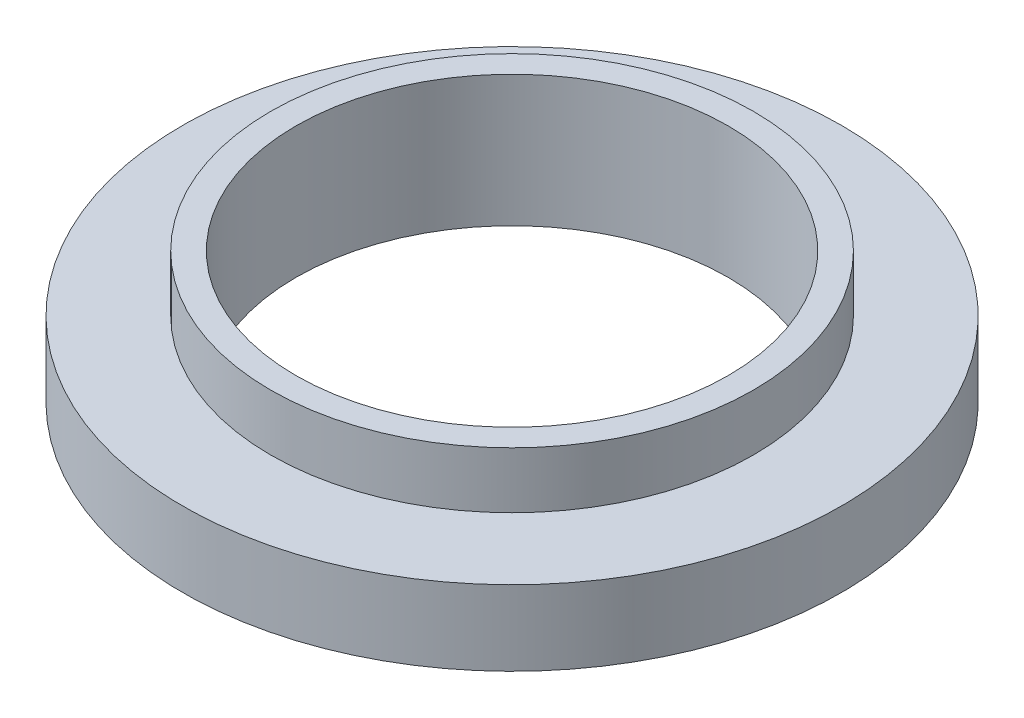
ISO-10303-21;
HEADER;
FILE_DESCRIPTION(('STEP AP214'),'2;1');
FILE_NAME('part.step','',(''),(''),'','','');
FILE_SCHEMA(('AUTOMOTIVE_DESIGN { 1 0 10303 214 1 1 1 1 }'));
ENDSEC;
DATA;
#1=APPLICATION_CONTEXT('core data for automotive mechanical design processes');
#2=APPLICATION_PROTOCOL_DEFINITION('international standard','automotive_design',2000,#1);
#3=PRODUCT_CONTEXT('',#1,'mechanical');
#4=PRODUCT('Part','Part','',(#3));
#5=PRODUCT_RELATED_PRODUCT_CATEGORY('part','',(#4));
#6=PRODUCT_DEFINITION_FORMATION('','',#4);
#7=PRODUCT_DEFINITION_CONTEXT('part definition',#1,'design');
#8=PRODUCT_DEFINITION('design','',#6,#7);
#9=PRODUCT_DEFINITION_SHAPE('','',#8);
#10=(LENGTH_UNIT() NAMED_UNIT(*) SI_UNIT(.MILLI.,.METRE.));
#11=(NAMED_UNIT(*) PLANE_ANGLE_UNIT() SI_UNIT($,.RADIAN.));
#12=(NAMED_UNIT(*) SI_UNIT($,.STERADIAN.) SOLID_ANGLE_UNIT());
#13=UNCERTAINTY_MEASURE_WITH_UNIT(LENGTH_MEASURE(1.E-05),#10,'distance_accuracy_value','');
#14=(GEOMETRIC_REPRESENTATION_CONTEXT(3) GLOBAL_UNCERTAINTY_ASSIGNED_CONTEXT((#13)) GLOBAL_UNIT_ASSIGNED_CONTEXT((#10,
#11,#12)) REPRESENTATION_CONTEXT('',''));
#15=CARTESIAN_POINT('',(0.,0.,0.));
#16=DIRECTION('',(0.,0.,1.));
#17=DIRECTION('',(1.,0.,0.));
#18=AXIS2_PLACEMENT_3D('',#15,#16,#17);
#19=CARTESIAN_POINT('',(0.,0.,0.));
#20=DIRECTION('',(0.,-1.,0.));
#21=DIRECTION('',(0.,0.,-1.));
#22=AXIS2_PLACEMENT_3D('',#19,#20,#21);
#23=CYLINDRICAL_SURFACE('',#22,35.45);
#24=CARTESIAN_POINT('',(0.,22.0238096535735,0.));
#25=DIRECTION('',(0.,-1.,0.));
#26=DIRECTION('',(0.,0.,-1.));
#27=AXIS2_PLACEMENT_3D('',#24,#25,#26);
#28=CIRCLE('',#27,35.45);
#29=CARTESIAN_POINT('',(0.,22.0238096535735,-35.45));
#30=VERTEX_POINT('',#29);
#31=EDGE_CURVE('E54',#30,#30,#28,.T.);
#32=ORIENTED_EDGE('',*,*,#31,.F.);
#33=EDGE_LOOP('',(#32));
#34=FACE_BOUND('',#33,.T.);
#35=CARTESIAN_POINT('',(0.,30.28420647366,0.));
#36=DIRECTION('',(0.,-1.,0.));
#37=DIRECTION('',(0.,0.,-1.));
#38=AXIS2_PLACEMENT_3D('',#35,#36,#37);
#39=CIRCLE('',#38,35.45);
#40=CARTESIAN_POINT('',(0.,30.28420647366,-35.45));
#41=VERTEX_POINT('',#40);
#42=EDGE_CURVE('E10',#41,#41,#39,.T.);
#43=ORIENTED_EDGE('',*,*,#42,.T.);
#44=EDGE_LOOP('',(#43));
#45=FACE_BOUND('',#44,.T.);
#46=ADVANCED_FACE('F32',(#34,#45),#23,.T.);
#47=CARTESIAN_POINT('',(-31.75,30.28420647366,0.));
#48=DIRECTION('',(0.,-1.,0.));
#49=DIRECTION('',(0.,0.,-1.));
#50=AXIS2_PLACEMENT_3D('',#47,#48,#49);
#51=PLANE('',#50);
#52=ORIENTED_EDGE('',*,*,#42,.F.);
#53=EDGE_LOOP('',(#52));
#54=FACE_BOUND('',#53,.T.);
#55=CARTESIAN_POINT('',(0.,30.28420647366,0.));
#56=DIRECTION('',(0.,-1.,0.));
#57=DIRECTION('',(0.,0.,-1.));
#58=AXIS2_PLACEMENT_3D('',#55,#56,#57);
#59=CIRCLE('',#58,31.75);
#60=CARTESIAN_POINT('',(0.,30.28420647366,-31.75));
#61=VERTEX_POINT('',#60);
#62=EDGE_CURVE('E38',#61,#61,#59,.T.);
#63=ORIENTED_EDGE('',*,*,#62,.T.);
#64=EDGE_LOOP('',(#63));
#65=FACE_BOUND('',#64,.T.);
#66=ADVANCED_FACE('F61',(#54,#65),#51,.F.);
#67=CARTESIAN_POINT('',(0.,0.,0.));
#68=DIRECTION('',(0.,-1.,0.));
#69=DIRECTION('',(0.,0.,-1.));
#70=AXIS2_PLACEMENT_3D('',#67,#68,#69);
#71=CYLINDRICAL_SURFACE('',#70,31.75);
#72=ORIENTED_EDGE('',*,*,#62,.F.);
#73=EDGE_LOOP('',(#72));
#74=FACE_BOUND('',#73,.T.);
#75=CARTESIAN_POINT('',(0.,11.0119048916687,0.));
#76=DIRECTION('',(0.,-1.,0.));
#77=DIRECTION('',(0.,0.,-1.));
#78=AXIS2_PLACEMENT_3D('',#75,#76,#77);
#79=CIRCLE('',#78,31.75);
#80=CARTESIAN_POINT('',(0.,11.0119048916687,-31.75));
#81=VERTEX_POINT('',#80);
#82=EDGE_CURVE('E42',#81,#81,#79,.T.);
#83=ORIENTED_EDGE('',*,*,#82,.T.);
#84=EDGE_LOOP('',(#83));
#85=FACE_BOUND('',#84,.T.);
#86=ADVANCED_FACE('F65',(#74,#85),#71,.F.);
#87=CARTESIAN_POINT('',(-37.9123364852843,11.0119048916687,0.));
#88=DIRECTION('',(0.,1.,0.));
#89=DIRECTION('',(0.,0.,1.));
#90=AXIS2_PLACEMENT_3D('',#87,#88,#89);
#91=PLANE('',#90);
#92=ORIENTED_EDGE('',*,*,#82,.F.);
#93=EDGE_LOOP('',(#92));
#94=FACE_BOUND('',#93,.T.);
#95=CARTESIAN_POINT('',(0.,11.0119048916687,0.));
#96=DIRECTION('',(0.,-1.,0.));
#97=DIRECTION('',(0.,0.,-1.));
#98=AXIS2_PLACEMENT_3D('',#95,#96,#97);
#99=CIRCLE('',#98,48.4);
#100=CARTESIAN_POINT('',(0.,11.0119048916687,-48.4));
#101=VERTEX_POINT('',#100);
#102=EDGE_CURVE('E46',#101,#101,#99,.T.);
#103=ORIENTED_EDGE('',*,*,#102,.T.);
#104=EDGE_LOOP('',(#103));
#105=FACE_BOUND('',#104,.T.);
#106=ADVANCED_FACE('F70',(#94,#105),#91,.F.);
#107=CARTESIAN_POINT('',(0.,0.,0.));
#108=DIRECTION('',(0.,-1.,0.));
#109=DIRECTION('',(0.,0.,-1.));
#110=AXIS2_PLACEMENT_3D('',#107,#108,#109);
#111=CYLINDRICAL_SURFACE('',#110,48.4);
#112=ORIENTED_EDGE('',*,*,#102,.F.);
#113=EDGE_LOOP('',(#112));
#114=FACE_BOUND('',#113,.T.);
#115=CARTESIAN_POINT('',(0.,22.0238096535735,0.));
#116=DIRECTION('',(0.,-1.,0.));
#117=DIRECTION('',(0.,0.,-1.));
#118=AXIS2_PLACEMENT_3D('',#115,#116,#117);
#119=CIRCLE('',#118,48.4);
#120=CARTESIAN_POINT('',(0.,22.0238096535735,-48.4));
#121=VERTEX_POINT('',#120);
#122=EDGE_CURVE('E51',#121,#121,#119,.T.);
#123=ORIENTED_EDGE('',*,*,#122,.T.);
#124=EDGE_LOOP('',(#123));
#125=FACE_BOUND('',#124,.T.);
#126=ADVANCED_FACE('F76',(#114,#125),#111,.T.);
#127=CARTESIAN_POINT('',(-35.45,22.0238096535735,0.));
#128=DIRECTION('',(0.,-1.,0.));
#129=DIRECTION('',(0.,0.,-1.));
#130=AXIS2_PLACEMENT_3D('',#127,#128,#129);
#131=PLANE('',#130);
#132=ORIENTED_EDGE('',*,*,#122,.F.);
#133=EDGE_LOOP('',(#132));
#134=FACE_BOUND('',#133,.T.);
#135=ORIENTED_EDGE('',*,*,#31,.T.);
#136=EDGE_LOOP('',(#135));
#137=FACE_BOUND('',#136,.T.);
#138=ADVANCED_FACE('F58',(#134,#137),#131,.F.);
#139=CLOSED_SHELL('',(#46,#66,#86,#106,#126,#138));
#140=MANIFOLD_SOLID_BREP('B2',#139);
#141=ADVANCED_BREP_SHAPE_REPRESENTATION('',(#18,#140),#14);
#142=SHAPE_DEFINITION_REPRESENTATION(#9,#141);
ENDSEC;
END-ISO-10303-21;
